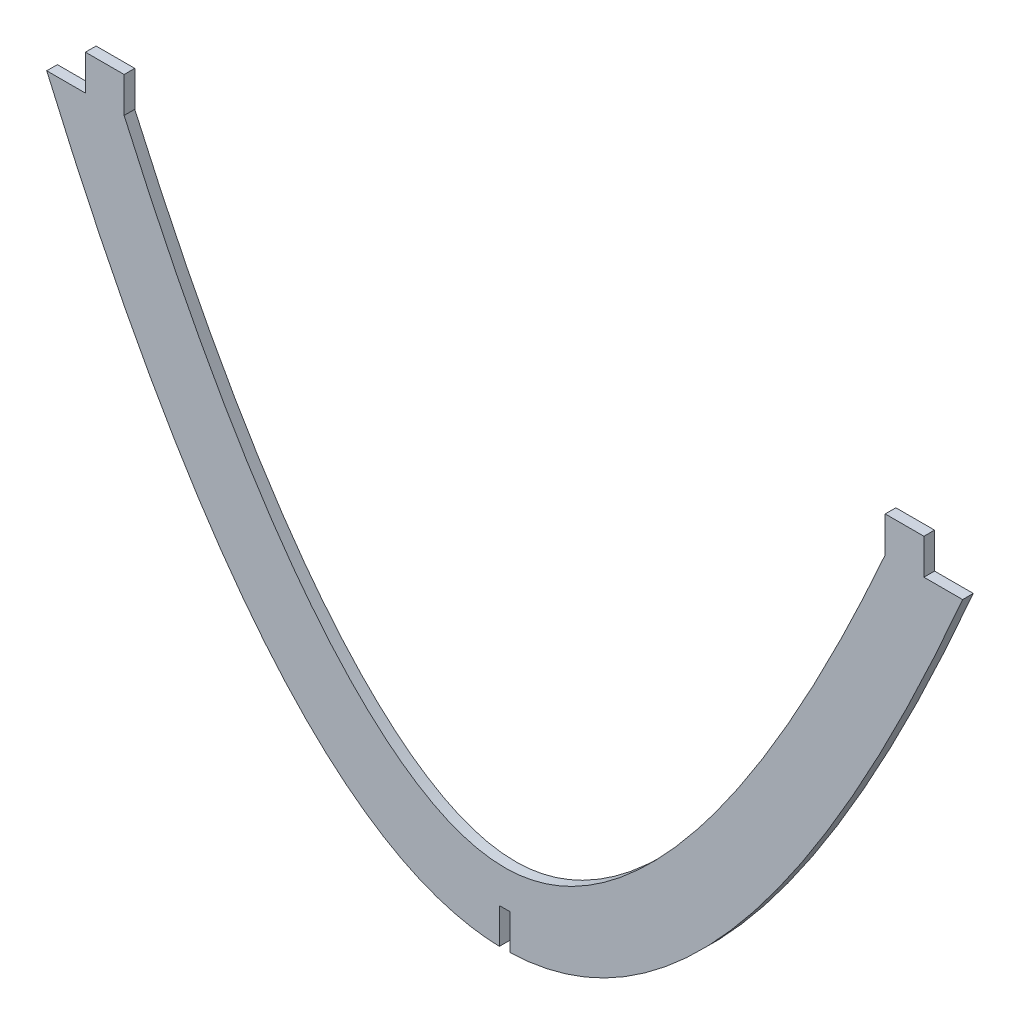
ISO-10303-21;
HEADER;
FILE_DESCRIPTION(('STEP AP214'),'2;1');
FILE_NAME('part.step','',(''),(''),'','','');
FILE_SCHEMA(('AUTOMOTIVE_DESIGN { 1 0 10303 214 1 1 1 1 }'));
ENDSEC;
DATA;
#1=APPLICATION_CONTEXT('core data for automotive mechanical design processes');
#2=APPLICATION_PROTOCOL_DEFINITION('international standard','automotive_design',2000,#1);
#3=PRODUCT_CONTEXT('',#1,'mechanical');
#4=PRODUCT('Part','Part','',(#3));
#5=PRODUCT_RELATED_PRODUCT_CATEGORY('part','',(#4));
#6=PRODUCT_DEFINITION_FORMATION('','',#4);
#7=PRODUCT_DEFINITION_CONTEXT('part definition',#1,'design');
#8=PRODUCT_DEFINITION('design','',#6,#7);
#9=PRODUCT_DEFINITION_SHAPE('','',#8);
#10=(LENGTH_UNIT() NAMED_UNIT(*) SI_UNIT(.MILLI.,.METRE.));
#11=(NAMED_UNIT(*) PLANE_ANGLE_UNIT() SI_UNIT($,.RADIAN.));
#12=(NAMED_UNIT(*) SI_UNIT($,.STERADIAN.) SOLID_ANGLE_UNIT());
#13=UNCERTAINTY_MEASURE_WITH_UNIT(LENGTH_MEASURE(1.E-05),#10,'distance_accuracy_value','');
#14=(GEOMETRIC_REPRESENTATION_CONTEXT(3) GLOBAL_UNCERTAINTY_ASSIGNED_CONTEXT((#13)) GLOBAL_UNIT_ASSIGNED_CONTEXT((#10,
#11,#12)) REPRESENTATION_CONTEXT('',''));
#15=CARTESIAN_POINT('',(0.,0.,0.));
#16=DIRECTION('',(0.,0.,1.));
#17=DIRECTION('',(1.,0.,0.));
#18=AXIS2_PLACEMENT_3D('',#15,#16,#17);
#19=CARTESIAN_POINT('',(-129.099444876063,150.000000005769,3.));
#20=CARTESIAN_POINT('',(-2.715543068188E-09,-149.999999999459,3.));
#21=CARTESIAN_POINT('',(129.099444870632,149.999999993149,3.));
#22=B_SPLINE_CURVE_WITH_KNOTS('',2,(#19,#20,#21),.UNSPECIFIED.,.F.,.F.,(3,3),
(0.0539505103619018,0.946049489619333),.UNSPECIFIED.);
#23=DIRECTION('',(0.,0.,-1.));
#24=VECTOR('',#23,1.);
#25=SURFACE_OF_LINEAR_EXTRUSION('',#22,#24);
#26=DIRECTION('',(0.,0.,-1.));
#27=VECTOR('',#26,1.);
#28=CARTESIAN_POINT('',(1.5,0.0202499999999879,3.));
#29=LINE('',#28,#27);
#30=CARTESIAN_POINT('',(1.5,0.020249999999989,0.));
#31=VERTEX_POINT('',#30);
#32=CARTESIAN_POINT('',(1.5,0.020249999999989,3.));
#33=VERTEX_POINT('',#32);
#34=EDGE_CURVE('E259',#31,#33,#29,.F.);
#35=ORIENTED_EDGE('',*,*,#34,.F.);
#36=CARTESIAN_POINT('',(-129.099444876063,150.000000005769,0.));
#37=CARTESIAN_POINT('',(-2.715543068188E-09,-149.999999999459,0.));
#38=CARTESIAN_POINT('',(129.099444870632,149.999999993149,0.));
#39=B_SPLINE_CURVE_WITH_KNOTS('',2,(#36,#37,#38),.UNSPECIFIED.,.F.,.F.,(3,3),
(0.0539505103619018,0.946049489619333),.UNSPECIFIED.);
#40=CARTESIAN_POINT('',(129.099444870632,149.999999993149,0.));
#41=VERTEX_POINT('',#40);
#42=EDGE_CURVE('E314',#31,#41,#39,.T.);
#43=ORIENTED_EDGE('',*,*,#42,.T.);
#44=DIRECTION('',(0.,0.,-1.));
#45=VECTOR('',#44,1.);
#46=CARTESIAN_POINT('',(129.099444870632,149.999999993149,3.));
#47=LINE('',#46,#45);
#48=CARTESIAN_POINT('',(129.099444870632,149.999999993149,3.));
#49=VERTEX_POINT('',#48);
#50=EDGE_CURVE('E144',#49,#41,#47,.T.);
#51=ORIENTED_EDGE('',*,*,#50,.F.);
#52=EDGE_CURVE('E159',#33,#49,#22,.T.);
#53=ORIENTED_EDGE('',*,*,#52,.F.);
#54=EDGE_LOOP('',(#35,#43,#51,#53));
#55=FACE_BOUND('',#54,.T.);
#56=ADVANCED_FACE('F39',(#55),#25,.F.);
#57=DIRECTION('',(0.,0.,-1.));
#58=VECTOR('',#57,1.);
#59=CARTESIAN_POINT('',(-1.49986335607809,0.0202463107821336,3.));
#60=LINE('',#59,#58);
#61=CARTESIAN_POINT('',(-1.4998633560781,0.0202463107821342,3.));
#62=VERTEX_POINT('',#61);
#63=CARTESIAN_POINT('',(-1.49986335607809,0.0202463107821336,0.));
#64=VERTEX_POINT('',#63);
#65=EDGE_CURVE('E55',#62,#64,#60,.T.);
#66=ORIENTED_EDGE('',*,*,#65,.F.);
#67=CARTESIAN_POINT('',(-129.099444876063,150.000000005769,3.));
#68=VERTEX_POINT('',#67);
#69=EDGE_CURVE('E164',#68,#62,#22,.T.);
#70=ORIENTED_EDGE('',*,*,#69,.F.);
#71=DIRECTION('',(0.,0.,-1.));
#72=VECTOR('',#71,1.);
#73=CARTESIAN_POINT('',(-129.099444876063,150.000000005769,3.));
#74=LINE('',#73,#72);
#75=CARTESIAN_POINT('',(-129.099444876063,150.000000005769,0.));
#76=VERTEX_POINT('',#75);
#77=EDGE_CURVE('E48',#68,#76,#74,.T.);
#78=ORIENTED_EDGE('',*,*,#77,.T.);
#79=EDGE_CURVE('E258',#76,#64,#39,.T.);
#80=ORIENTED_EDGE('',*,*,#79,.T.);
#81=EDGE_LOOP('',(#66,#70,#78,#80));
#82=FACE_BOUND('',#81,.T.);
#83=ADVANCED_FACE('F182',(#82),#25,.F.);
#84=CARTESIAN_POINT('',(-1.68496325832906E-09,19.9978447571531,3.));
#85=DIRECTION('',(0.,0.,-1.));
#86=DIRECTION('',(-1.,0.,0.));
#87=AXIS2_PLACEMENT_3D('',#84,#85,#86);
#88=PLANE('',#87);
#89=DIRECTION('',(0.,1.,0.));
#90=VECTOR('',#89,1.);
#91=CARTESIAN_POINT('',(1.5,19.9978447571531,3.));
#92=LINE('',#91,#90);
#93=CARTESIAN_POINT('',(1.5,9.99892237931655,3.));
#94=VERTEX_POINT('',#93);
#95=EDGE_CURVE('E263',#33,#94,#92,.T.);
#96=ORIENTED_EDGE('',*,*,#95,.F.);
#97=ORIENTED_EDGE('',*,*,#52,.T.);
#98=DIRECTION('',(1.,0.,0.));
#99=VECTOR('',#98,1.);
#100=CARTESIAN_POINT('',(118.189248572033,149.999999993267,3.));
#101=LINE('',#100,#99);
#102=CARTESIAN_POINT('',(118.189248572033,149.999999993267,3.));
#103=VERTEX_POINT('',#102);
#104=EDGE_CURVE('E138',#103,#49,#101,.T.);
#105=ORIENTED_EDGE('',*,*,#104,.F.);
#106=DIRECTION('',(0.,1.,0.));
#107=VECTOR('',#106,1.);
#108=CARTESIAN_POINT('',(118.189248572033,149.999999993267,3.));
#109=LINE('',#108,#107);
#110=CARTESIAN_POINT('',(118.189248572033,159.999999993385,3.));
#111=VERTEX_POINT('',#110);
#112=EDGE_CURVE('E148',#103,#111,#109,.T.);
#113=ORIENTED_EDGE('',*,*,#112,.T.);
#114=DIRECTION('',(-1.,0.,0.));
#115=VECTOR('',#114,1.);
#116=CARTESIAN_POINT('',(118.189248572033,159.999999993385,3.));
#117=LINE('',#116,#115);
#118=CARTESIAN_POINT('',(107.279052273317,159.999999993385,3.));
#119=VERTEX_POINT('',#118);
#120=EDGE_CURVE('E154',#111,#119,#117,.T.);
#121=ORIENTED_EDGE('',*,*,#120,.T.);
#122=DIRECTION('',(0.,-1.,0.));
#123=VECTOR('',#122,1.);
#124=CARTESIAN_POINT('',(107.279052273317,159.999999993385,3.));
#125=LINE('',#124,#123);
#126=CARTESIAN_POINT('',(107.279052273317,149.999999993386,3.));
#127=VERTEX_POINT('',#126);
#128=EDGE_CURVE('E213',#119,#127,#125,.T.);
#129=ORIENTED_EDGE('',*,*,#128,.T.);
#130=CARTESIAN_POINT('',(-110.729616476161,157.90521362359,3.));
#131=CARTESIAN_POINT('',(-98.8837153655669,130.396122787009,3.));
#132=CARTESIAN_POINT('',(-79.4447336842169,93.7084406042849,3.));
#133=CARTESIAN_POINT('',(-64.1616751281173,69.3083654888399,3.));
#134=CARTESIAN_POINT('',(-49.3053935462645,49.915770108838,3.));
#135=CARTESIAN_POINT('',(-35.1386648599346,35.5552312559467,3.));
#136=CARTESIAN_POINT('',(-22.0483555352086,26.1131292484053,3.));
#137=CARTESIAN_POINT('',(-11.8554221367761,21.7244217589889,3.));
#138=CARTESIAN_POINT('',(-5.17246226951511,20.2782443848144,3.));
#139=CARTESIAN_POINT('',(-1.67729788522995E-09,19.9043782146822,3.));
#140=CARTESIAN_POINT('',(5.17246226609911,20.2782443843172,3.));
#141=CARTESIAN_POINT('',(11.8554221331508,21.7244217578089,3.));
#142=CARTESIAN_POINT('',(22.0483555311498,26.1131292460623,3.));
#143=CARTESIAN_POINT('',(35.1386648554452,35.5552312520328,3.));
#144=CARTESIAN_POINT('',(49.3053935414862,49.91577010327,3.));
#145=CARTESIAN_POINT('',(64.1616751231564,69.3083654816119,3.));
#146=CARTESIAN_POINT('',(79.4447336791401,93.7084405954139,3.));
#147=CARTESIAN_POINT('',(98.8837153603944,130.396122776109,3.));
#148=CARTESIAN_POINT('',(110.729616470956,157.905213611492,3.));
#149=B_SPLINE_CURVE_WITH_KNOTS('',2,(#130,#131,#132,#133,#134,#135,#136,#137,#138,#139,#140,
#141,#142,#143,#144,#145,#146,#147,#148),.UNSPECIFIED.,.F.,.F.,(3,1,1,1,1,1,1,1,1,1,1,1,1,1,1,1,
1,3),(0.0539505103620546,0.137584789667441,0.193340975871032,0.249097162074623,
0.304853348278214,0.360609534481804,0.416365720685395,0.458182860338089,0.486060953439884,
0.513939046541679,0.541817139643475,0.583634279296168,0.639390465499759,0.69514665170335,
0.750902837906941,0.806659024110532,0.862415210314122,0.946049489619509),.UNSPECIFIED.);
#150=CARTESIAN_POINT('',(-107.279052277839,150.000000003613,3.));
#151=VERTEX_POINT('',#150);
#152=EDGE_CURVE('E205',#151,#127,#149,.T.);
#153=ORIENTED_EDGE('',*,*,#152,.F.);
#154=DIRECTION('',(0.,-1.,0.));
#155=VECTOR('',#154,1.);
#156=CARTESIAN_POINT('',(-107.279052277839,160.000000005667,3.));
#157=LINE('',#156,#155);
#158=CARTESIAN_POINT('',(-107.279052277839,160.000000005667,3.));
#159=VERTEX_POINT('',#158);
#160=EDGE_CURVE('E214',#159,#151,#157,.T.);
#161=ORIENTED_EDGE('',*,*,#160,.F.);
#162=DIRECTION('',(1.,0.,0.));
#163=VECTOR('',#162,1.);
#164=CARTESIAN_POINT('',(-118.18924857737,160.000000005667,3.));
#165=LINE('',#164,#163);
#166=CARTESIAN_POINT('',(-118.18924857737,160.000000005667,3.));
#167=VERTEX_POINT('',#166);
#168=EDGE_CURVE('E248',#167,#159,#165,.T.);
#169=ORIENTED_EDGE('',*,*,#168,.F.);
#170=DIRECTION('',(0.,1.,0.));
#171=VECTOR('',#170,1.);
#172=CARTESIAN_POINT('',(-118.18924857737,150.000000005667,3.));
#173=LINE('',#172,#171);
#174=CARTESIAN_POINT('',(-118.18924857737,150.000000005667,3.));
#175=VERTEX_POINT('',#174);
#176=EDGE_CURVE('E250',#175,#167,#173,.T.);
#177=ORIENTED_EDGE('',*,*,#176,.F.);
#178=DIRECTION('',(1.,0.,0.));
#179=VECTOR('',#178,1.);
#180=CARTESIAN_POINT('',(-129.099444876019,150.000000005667,3.));
#181=LINE('',#180,#179);
#182=EDGE_CURVE('E253',#68,#175,#181,.T.);
#183=ORIENTED_EDGE('',*,*,#182,.F.);
#184=ORIENTED_EDGE('',*,*,#69,.T.);
#185=DIRECTION('',(0.,-1.,0.));
#186=VECTOR('',#185,1.);
#187=CARTESIAN_POINT('',(-1.4998633560781,19.9978447571531,3.));
#188=LINE('',#187,#186);
#189=CARTESIAN_POINT('',(-1.4998633560781,9.99892237931655,3.));
#190=VERTEX_POINT('',#189);
#191=EDGE_CURVE('E273',#190,#62,#188,.T.);
#192=ORIENTED_EDGE('',*,*,#191,.F.);
#193=DIRECTION('',(-1.,0.,0.));
#194=VECTOR('',#193,1.);
#195=CARTESIAN_POINT('',(-1.68496325832906E-09,9.99892237931655,3.));
#196=LINE('',#195,#194);
#197=EDGE_CURVE('E267',#94,#190,#196,.T.);
#198=ORIENTED_EDGE('',*,*,#197,.F.);
#199=EDGE_LOOP('',(#96,#97,#105,#113,#121,#129,#153,#161,#169,#177,#183,#184,#192,#198));
#200=FACE_BOUND('',#199,.T.);
#201=ADVANCED_FACE('F157',(#200),#88,.F.);
#202=CARTESIAN_POINT('',(-1.68496325832906E-09,19.9978447571531,0.));
#203=DIRECTION('',(0.,0.,-1.));
#204=DIRECTION('',(-1.,0.,0.));
#205=AXIS2_PLACEMENT_3D('',#202,#203,#204);
#206=PLANE('',#205);
#207=ORIENTED_EDGE('',*,*,#42,.F.);
#208=DIRECTION('',(0.,1.,0.));
#209=VECTOR('',#208,1.);
#210=CARTESIAN_POINT('',(1.5,19.9978447571531,0.));
#211=LINE('',#210,#209);
#212=CARTESIAN_POINT('',(1.5,9.99892237931655,0.));
#213=VERTEX_POINT('',#212);
#214=EDGE_CURVE('E11',#31,#213,#211,.T.);
#215=ORIENTED_EDGE('',*,*,#214,.T.);
#216=DIRECTION('',(-1.,0.,0.));
#217=VECTOR('',#216,1.);
#218=CARTESIAN_POINT('',(-1.4998633560781,9.99892237931655,0.));
#219=LINE('',#218,#217);
#220=CARTESIAN_POINT('',(-1.4998633560781,9.99892237931655,0.));
#221=VERTEX_POINT('',#220);
#222=EDGE_CURVE('E287',#213,#221,#219,.T.);
#223=ORIENTED_EDGE('',*,*,#222,.T.);
#224=DIRECTION('',(0.,-1.,0.));
#225=VECTOR('',#224,1.);
#226=CARTESIAN_POINT('',(-1.4998633560781,9.99892237931655,0.));
#227=LINE('',#226,#225);
#228=EDGE_CURVE('E284',#221,#64,#227,.T.);
#229=ORIENTED_EDGE('',*,*,#228,.T.);
#230=ORIENTED_EDGE('',*,*,#79,.F.);
#231=DIRECTION('',(1.,0.,0.));
#232=VECTOR('',#231,1.);
#233=CARTESIAN_POINT('',(-129.099444876019,150.000000005667,0.));
#234=LINE('',#233,#232);
#235=CARTESIAN_POINT('',(-118.18924857737,150.000000005667,0.));
#236=VERTEX_POINT('',#235);
#237=EDGE_CURVE('E173',#76,#236,#234,.T.);
#238=ORIENTED_EDGE('',*,*,#237,.T.);
#239=DIRECTION('',(0.,1.,0.));
#240=VECTOR('',#239,1.);
#241=CARTESIAN_POINT('',(-118.18924857737,150.000000005667,0.));
#242=LINE('',#241,#240);
#243=CARTESIAN_POINT('',(-118.18924857737,160.000000005667,0.));
#244=VERTEX_POINT('',#243);
#245=EDGE_CURVE('E333',#236,#244,#242,.T.);
#246=ORIENTED_EDGE('',*,*,#245,.T.);
#247=DIRECTION('',(1.,0.,0.));
#248=VECTOR('',#247,1.);
#249=CARTESIAN_POINT('',(-118.18924857737,160.000000005667,0.));
#250=LINE('',#249,#248);
#251=CARTESIAN_POINT('',(-107.279052277839,160.000000005667,0.));
#252=VERTEX_POINT('',#251);
#253=EDGE_CURVE('E338',#244,#252,#250,.T.);
#254=ORIENTED_EDGE('',*,*,#253,.T.);
#255=DIRECTION('',(0.,-1.,0.));
#256=VECTOR('',#255,1.);
#257=CARTESIAN_POINT('',(-107.279052277839,160.000000005667,0.));
#258=LINE('',#257,#256);
#259=CARTESIAN_POINT('',(-107.279052277839,150.000000003613,0.));
#260=VERTEX_POINT('',#259);
#261=EDGE_CURVE('E342',#252,#260,#258,.T.);
#262=ORIENTED_EDGE('',*,*,#261,.T.);
#263=CARTESIAN_POINT('',(-110.729616476161,157.90521362359,0.));
#264=CARTESIAN_POINT('',(-98.8837153655669,130.396122787009,0.));
#265=CARTESIAN_POINT('',(-79.4447336842169,93.7084406042849,0.));
#266=CARTESIAN_POINT('',(-64.1616751281173,69.3083654888399,0.));
#267=CARTESIAN_POINT('',(-49.3053935462645,49.915770108838,0.));
#268=CARTESIAN_POINT('',(-35.1386648599346,35.5552312559467,0.));
#269=CARTESIAN_POINT('',(-22.0483555352086,26.1131292484053,0.));
#270=CARTESIAN_POINT('',(-11.8554221367761,21.7244217589889,0.));
#271=CARTESIAN_POINT('',(-5.17246226951511,20.2782443848144,0.));
#272=CARTESIAN_POINT('',(-1.67729788522995E-09,19.9043782146822,0.));
#273=CARTESIAN_POINT('',(5.17246226609911,20.2782443843172,0.));
#274=CARTESIAN_POINT('',(11.8554221331508,21.7244217578089,0.));
#275=CARTESIAN_POINT('',(22.0483555311498,26.1131292460623,0.));
#276=CARTESIAN_POINT('',(35.1386648554452,35.5552312520328,0.));
#277=CARTESIAN_POINT('',(49.3053935414862,49.91577010327,0.));
#278=CARTESIAN_POINT('',(64.1616751231564,69.3083654816119,0.));
#279=CARTESIAN_POINT('',(79.4447336791401,93.7084405954139,0.));
#280=CARTESIAN_POINT('',(98.8837153603944,130.396122776109,0.));
#281=CARTESIAN_POINT('',(110.729616470956,157.905213611492,0.));
#282=B_SPLINE_CURVE_WITH_KNOTS('',2,(#263,#264,#265,#266,#267,#268,#269,#270,#271,#272,#273,
#274,#275,#276,#277,#278,#279,#280,#281),.UNSPECIFIED.,.F.,.F.,(3,1,1,1,1,1,1,1,1,1,1,1,1,1,1,1,
1,3),(0.0539505103620546,0.137584789667441,0.193340975871032,0.249097162074623,
0.304853348278214,0.360609534481804,0.416365720685395,0.458182860338089,0.486060953439884,
0.513939046541679,0.541817139643475,0.583634279296168,0.639390465499759,0.69514665170335,
0.750902837906941,0.806659024110532,0.862415210314122,0.946049489619509),.UNSPECIFIED.);
#283=CARTESIAN_POINT('',(107.279052273317,149.999999993386,0.));
#284=VERTEX_POINT('',#283);
#285=EDGE_CURVE('E346',#260,#284,#282,.T.);
#286=ORIENTED_EDGE('',*,*,#285,.T.);
#287=DIRECTION('',(0.,-1.,0.));
#288=VECTOR('',#287,1.);
#289=CARTESIAN_POINT('',(107.279052273317,159.999999993385,0.));
#290=LINE('',#289,#288);
#291=CARTESIAN_POINT('',(107.279052273317,159.999999993385,0.));
#292=VERTEX_POINT('',#291);
#293=EDGE_CURVE('E234',#292,#284,#290,.T.);
#294=ORIENTED_EDGE('',*,*,#293,.F.);
#295=DIRECTION('',(-1.,0.,0.));
#296=VECTOR('',#295,1.);
#297=CARTESIAN_POINT('',(118.189248572033,159.999999993385,0.));
#298=LINE('',#297,#296);
#299=CARTESIAN_POINT('',(118.189248572033,159.999999993385,0.));
#300=VERTEX_POINT('',#299);
#301=EDGE_CURVE('E228',#300,#292,#298,.T.);
#302=ORIENTED_EDGE('',*,*,#301,.F.);
#303=DIRECTION('',(0.,1.,0.));
#304=VECTOR('',#303,1.);
#305=CARTESIAN_POINT('',(118.189248572033,149.999999993267,0.));
#306=LINE('',#305,#304);
#307=CARTESIAN_POINT('',(118.189248572033,149.999999993267,0.));
#308=VERTEX_POINT('',#307);
#309=EDGE_CURVE('E353',#308,#300,#306,.T.);
#310=ORIENTED_EDGE('',*,*,#309,.F.);
#311=DIRECTION('',(1.,0.,0.));
#312=VECTOR('',#311,1.);
#313=CARTESIAN_POINT('',(118.189248572033,149.999999993267,0.));
#314=LINE('',#313,#312);
#315=EDGE_CURVE('E140',#308,#41,#314,.T.);
#316=ORIENTED_EDGE('',*,*,#315,.T.);
#317=EDGE_LOOP('',(#207,#215,#223,#229,#230,#238,#246,#254,#262,#286,#294,#302,#310,#316));
#318=FACE_BOUND('',#317,.T.);
#319=ADVANCED_FACE('F184',(#318),#206,.T.);
#320=CARTESIAN_POINT('',(-129.099444876019,150.000000005667,3.));
#321=DIRECTION('',(0.,1.,0.));
#322=DIRECTION('',(0.,0.,1.));
#323=AXIS2_PLACEMENT_3D('',#320,#321,#322);
#324=PLANE('',#323);
#325=ORIENTED_EDGE('',*,*,#237,.F.);
#326=ORIENTED_EDGE('',*,*,#77,.F.);
#327=ORIENTED_EDGE('',*,*,#182,.T.);
#328=DIRECTION('',(0.,0.,-1.));
#329=VECTOR('',#328,1.);
#330=CARTESIAN_POINT('',(-118.18924857737,150.000000005667,3.));
#331=LINE('',#330,#329);
#332=EDGE_CURVE('E108',#175,#236,#331,.T.);
#333=ORIENTED_EDGE('',*,*,#332,.T.);
#334=EDGE_LOOP('',(#325,#326,#327,#333));
#335=FACE_BOUND('',#334,.T.);
#336=ADVANCED_FACE('F41',(#335),#324,.T.);
#337=CARTESIAN_POINT('',(118.189248572033,149.999999993267,3.));
#338=DIRECTION('',(0.,1.,0.));
#339=DIRECTION('',(0.,0.,1.));
#340=AXIS2_PLACEMENT_3D('',#337,#338,#339);
#341=PLANE('',#340);
#342=ORIENTED_EDGE('',*,*,#315,.F.);
#343=DIRECTION('',(0.,0.,-1.));
#344=VECTOR('',#343,1.);
#345=CARTESIAN_POINT('',(118.189248572033,149.999999993267,3.));
#346=LINE('',#345,#344);
#347=EDGE_CURVE('E133',#103,#308,#346,.T.);
#348=ORIENTED_EDGE('',*,*,#347,.F.);
#349=ORIENTED_EDGE('',*,*,#104,.T.);
#350=ORIENTED_EDGE('',*,*,#50,.T.);
#351=EDGE_LOOP('',(#342,#348,#349,#350));
#352=FACE_BOUND('',#351,.T.);
#353=ADVANCED_FACE('F135',(#352),#341,.T.);
#354=CARTESIAN_POINT('',(118.189248572033,149.999999993267,3.));
#355=DIRECTION('',(-1.,0.,0.));
#356=DIRECTION('',(0.,0.,1.));
#357=AXIS2_PLACEMENT_3D('',#354,#355,#356);
#358=PLANE('',#357);
#359=ORIENTED_EDGE('',*,*,#309,.T.);
#360=DIRECTION('',(0.,0.,-1.));
#361=VECTOR('',#360,1.);
#362=CARTESIAN_POINT('',(118.189248572033,159.999999993385,3.));
#363=LINE('',#362,#361);
#364=EDGE_CURVE('E145',#111,#300,#363,.T.);
#365=ORIENTED_EDGE('',*,*,#364,.F.);
#366=ORIENTED_EDGE('',*,*,#112,.F.);
#367=ORIENTED_EDGE('',*,*,#347,.T.);
#368=EDGE_LOOP('',(#359,#365,#366,#367));
#369=FACE_BOUND('',#368,.T.);
#370=ADVANCED_FACE('F149',(#369),#358,.F.);
#371=CARTESIAN_POINT('',(118.189248572033,159.999999993385,3.));
#372=DIRECTION('',(0.,-1.,0.));
#373=DIRECTION('',(0.,0.,-1.));
#374=AXIS2_PLACEMENT_3D('',#371,#372,#373);
#375=PLANE('',#374);
#376=ORIENTED_EDGE('',*,*,#301,.T.);
#377=DIRECTION('',(0.,0.,-1.));
#378=VECTOR('',#377,1.);
#379=CARTESIAN_POINT('',(107.279052273317,159.999999993385,3.));
#380=LINE('',#379,#378);
#381=EDGE_CURVE('E226',#119,#292,#380,.T.);
#382=ORIENTED_EDGE('',*,*,#381,.F.);
#383=ORIENTED_EDGE('',*,*,#120,.F.);
#384=ORIENTED_EDGE('',*,*,#364,.T.);
#385=EDGE_LOOP('',(#376,#382,#383,#384));
#386=FACE_BOUND('',#385,.T.);
#387=ADVANCED_FACE('F190',(#386),#375,.F.);
#388=CARTESIAN_POINT('',(107.279052273317,159.999999993385,3.));
#389=DIRECTION('',(1.,0.,0.));
#390=DIRECTION('',(0.,1.,0.));
#391=AXIS2_PLACEMENT_3D('',#388,#389,#390);
#392=PLANE('',#391);
#393=ORIENTED_EDGE('',*,*,#293,.T.);
#394=DIRECTION('',(0.,0.,-1.));
#395=VECTOR('',#394,1.);
#396=CARTESIAN_POINT('',(107.279052273317,149.999999993386,3.));
#397=LINE('',#396,#395);
#398=EDGE_CURVE('E232',#127,#284,#397,.T.);
#399=ORIENTED_EDGE('',*,*,#398,.F.);
#400=ORIENTED_EDGE('',*,*,#128,.F.);
#401=ORIENTED_EDGE('',*,*,#381,.T.);
#402=EDGE_LOOP('',(#393,#399,#400,#401));
#403=FACE_BOUND('',#402,.T.);
#404=ADVANCED_FACE('F193',(#403),#392,.F.);
#405=DIRECTION('',(0.,0.,-1.));
#406=VECTOR('',#405,1.);
#407=SURFACE_OF_LINEAR_EXTRUSION('',#149,#406);
#408=ORIENTED_EDGE('',*,*,#285,.F.);
#409=DIRECTION('',(0.,0.,-1.));
#410=VECTOR('',#409,1.);
#411=CARTESIAN_POINT('',(-107.279052277839,150.000000003613,3.));
#412=LINE('',#411,#410);
#413=EDGE_CURVE('E238',#151,#260,#412,.T.);
#414=ORIENTED_EDGE('',*,*,#413,.F.);
#415=ORIENTED_EDGE('',*,*,#152,.T.);
#416=ORIENTED_EDGE('',*,*,#398,.T.);
#417=EDGE_LOOP('',(#408,#414,#415,#416));
#418=FACE_BOUND('',#417,.T.);
#419=ADVANCED_FACE('F197',(#418),#407,.T.);
#420=CARTESIAN_POINT('',(-107.279052277839,160.000000005667,3.));
#421=DIRECTION('',(1.,0.,0.));
#422=DIRECTION('',(0.,1.,0.));
#423=AXIS2_PLACEMENT_3D('',#420,#421,#422);
#424=PLANE('',#423);
#425=ORIENTED_EDGE('',*,*,#261,.F.);
#426=DIRECTION('',(0.,0.,-1.));
#427=VECTOR('',#426,1.);
#428=CARTESIAN_POINT('',(-107.279052277839,160.000000005667,3.));
#429=LINE('',#428,#427);
#430=EDGE_CURVE('E246',#159,#252,#429,.T.);
#431=ORIENTED_EDGE('',*,*,#430,.F.);
#432=ORIENTED_EDGE('',*,*,#160,.T.);
#433=ORIENTED_EDGE('',*,*,#413,.T.);
#434=EDGE_LOOP('',(#425,#431,#432,#433));
#435=FACE_BOUND('',#434,.T.);
#436=ADVANCED_FACE('F202',(#435),#424,.T.);
#437=CARTESIAN_POINT('',(-118.18924857737,160.000000005667,3.));
#438=DIRECTION('',(0.,1.,0.));
#439=DIRECTION('',(0.,0.,1.));
#440=AXIS2_PLACEMENT_3D('',#437,#438,#439);
#441=PLANE('',#440);
#442=ORIENTED_EDGE('',*,*,#253,.F.);
#443=DIRECTION('',(0.,0.,-1.));
#444=VECTOR('',#443,1.);
#445=CARTESIAN_POINT('',(-118.18924857737,160.000000005667,3.));
#446=LINE('',#445,#444);
#447=EDGE_CURVE('E327',#167,#244,#446,.T.);
#448=ORIENTED_EDGE('',*,*,#447,.F.);
#449=ORIENTED_EDGE('',*,*,#168,.T.);
#450=ORIENTED_EDGE('',*,*,#430,.T.);
#451=EDGE_LOOP('',(#442,#448,#449,#450));
#452=FACE_BOUND('',#451,.T.);
#453=ADVANCED_FACE('F400',(#452),#441,.T.);
#454=CARTESIAN_POINT('',(-118.18924857737,150.000000005667,3.));
#455=DIRECTION('',(-1.,0.,0.));
#456=DIRECTION('',(0.,0.,1.));
#457=AXIS2_PLACEMENT_3D('',#454,#455,#456);
#458=PLANE('',#457);
#459=ORIENTED_EDGE('',*,*,#245,.F.);
#460=ORIENTED_EDGE('',*,*,#332,.F.);
#461=ORIENTED_EDGE('',*,*,#176,.T.);
#462=ORIENTED_EDGE('',*,*,#447,.T.);
#463=EDGE_LOOP('',(#459,#460,#461,#462));
#464=FACE_BOUND('',#463,.T.);
#465=ADVANCED_FACE('F334',(#464),#458,.T.);
#466=CARTESIAN_POINT('',(1.5,9.99892237931655,59.));
#467=DIRECTION('',(-1.,0.,0.));
#468=DIRECTION('',(0.,0.,1.));
#469=AXIS2_PLACEMENT_3D('',#466,#467,#468);
#470=PLANE('',#469);
#471=ORIENTED_EDGE('',*,*,#34,.T.);
#472=ORIENTED_EDGE('',*,*,#95,.T.);
#473=DIRECTION('',(0.,0.,-1.));
#474=VECTOR('',#473,1.);
#475=CARTESIAN_POINT('',(1.5,9.99892237931655,59.));
#476=LINE('',#475,#474);
#477=EDGE_CURVE('E276',#94,#213,#476,.T.);
#478=ORIENTED_EDGE('',*,*,#477,.T.);
#479=ORIENTED_EDGE('',*,*,#214,.F.);
#480=EDGE_LOOP('',(#471,#472,#478,#479));
#481=FACE_BOUND('',#480,.T.);
#482=ADVANCED_FACE('F312',(#481),#470,.T.);
#483=CARTESIAN_POINT('',(-1.4998633560781,9.99892237931655,59.));
#484=DIRECTION('',(0.,-1.,0.));
#485=DIRECTION('',(0.,0.,-1.));
#486=AXIS2_PLACEMENT_3D('',#483,#484,#485);
#487=PLANE('',#486);
#488=ORIENTED_EDGE('',*,*,#197,.T.);
#489=DIRECTION('',(0.,0.,-1.));
#490=VECTOR('',#489,1.);
#491=CARTESIAN_POINT('',(-1.4998633560781,9.99892237931655,59.));
#492=LINE('',#491,#490);
#493=EDGE_CURVE('E280',#190,#221,#492,.T.);
#494=ORIENTED_EDGE('',*,*,#493,.T.);
#495=ORIENTED_EDGE('',*,*,#222,.F.);
#496=ORIENTED_EDGE('',*,*,#477,.F.);
#497=EDGE_LOOP('',(#488,#494,#495,#496));
#498=FACE_BOUND('',#497,.T.);
#499=ADVANCED_FACE('F300',(#498),#487,.T.);
#500=CARTESIAN_POINT('',(-1.4998633560781,9.99892237931655,59.));
#501=DIRECTION('',(1.,0.,0.));
#502=DIRECTION('',(0.,0.,-1.));
#503=AXIS2_PLACEMENT_3D('',#500,#501,#502);
#504=PLANE('',#503);
#505=ORIENTED_EDGE('',*,*,#65,.T.);
#506=ORIENTED_EDGE('',*,*,#228,.F.);
#507=ORIENTED_EDGE('',*,*,#493,.F.);
#508=ORIENTED_EDGE('',*,*,#191,.T.);
#509=EDGE_LOOP('',(#505,#506,#507,#508));
#510=FACE_BOUND('',#509,.T.);
#511=ADVANCED_FACE('F370',(#510),#504,.T.);
#512=CLOSED_SHELL('',(#56,#83,#201,#319,#336,#353,#370,#387,#404,#419,#436,#453,#465,#482,#499,#511));
#513=MANIFOLD_SOLID_BREP('B2',#512);
#514=ADVANCED_BREP_SHAPE_REPRESENTATION('',(#18,#513),#14);
#515=SHAPE_DEFINITION_REPRESENTATION(#9,#514);
ENDSEC;
END-ISO-10303-21;
